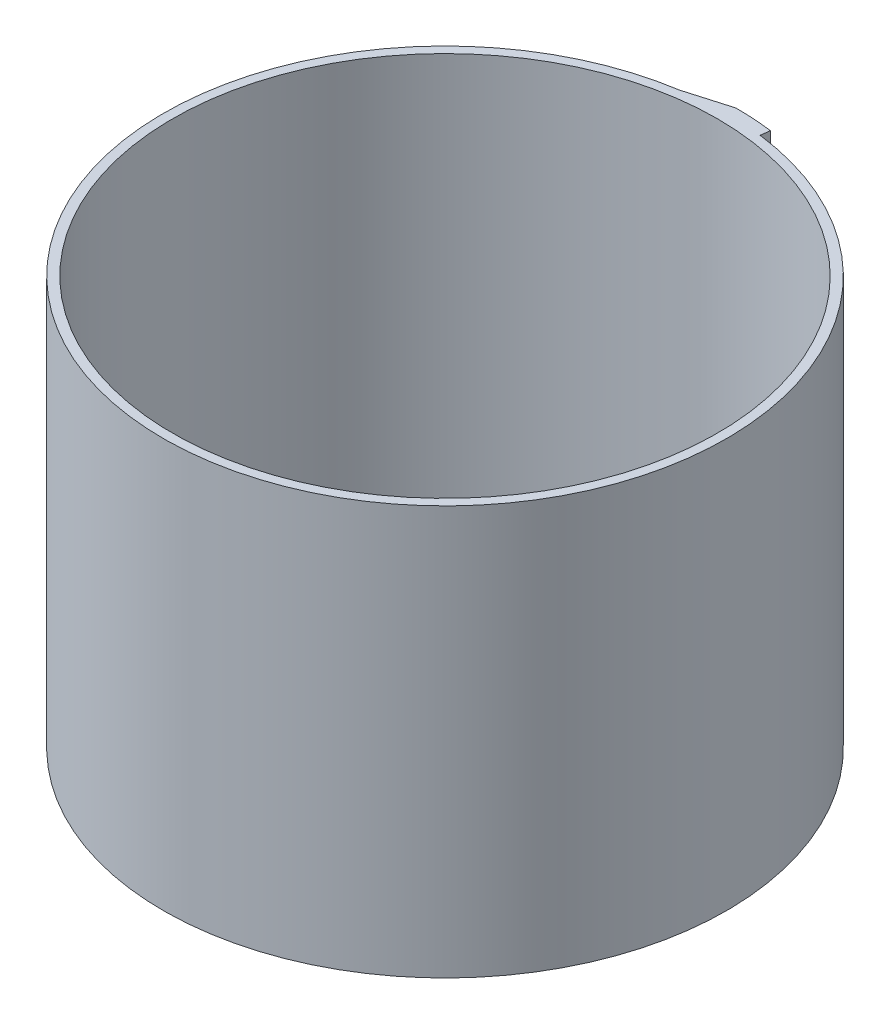
ISO-10303-21;
HEADER;
FILE_DESCRIPTION(('STEP AP214'),'2;1');
FILE_NAME('part.step','',(''),(''),'','','');
FILE_SCHEMA(('AUTOMOTIVE_DESIGN { 1 0 10303 214 1 1 1 1 }'));
ENDSEC;
DATA;
#1=APPLICATION_CONTEXT('core data for automotive mechanical design processes');
#2=APPLICATION_PROTOCOL_DEFINITION('international standard','automotive_design',2000,#1);
#3=PRODUCT_CONTEXT('',#1,'mechanical');
#4=PRODUCT('Part','Part','',(#3));
#5=PRODUCT_RELATED_PRODUCT_CATEGORY('part','',(#4));
#6=PRODUCT_DEFINITION_FORMATION('','',#4);
#7=PRODUCT_DEFINITION_CONTEXT('part definition',#1,'design');
#8=PRODUCT_DEFINITION('design','',#6,#7);
#9=PRODUCT_DEFINITION_SHAPE('','',#8);
#10=(LENGTH_UNIT() NAMED_UNIT(*) SI_UNIT(.MILLI.,.METRE.));
#11=(NAMED_UNIT(*) PLANE_ANGLE_UNIT() SI_UNIT($,.RADIAN.));
#12=(NAMED_UNIT(*) SI_UNIT($,.STERADIAN.) SOLID_ANGLE_UNIT());
#13=UNCERTAINTY_MEASURE_WITH_UNIT(LENGTH_MEASURE(1.E-05),#10,'distance_accuracy_value','');
#14=(GEOMETRIC_REPRESENTATION_CONTEXT(3) GLOBAL_UNCERTAINTY_ASSIGNED_CONTEXT((#13)) GLOBAL_UNIT_ASSIGNED_CONTEXT((#10,
#11,#12)) REPRESENTATION_CONTEXT('',''));
#15=CARTESIAN_POINT('',(0.,0.,0.));
#16=DIRECTION('',(0.,0.,1.));
#17=DIRECTION('',(1.,0.,0.));
#18=AXIS2_PLACEMENT_3D('',#15,#16,#17);
#19=CARTESIAN_POINT('',(-8.57396600948997,45.,-29.5306215414866));
#20=DIRECTION('',(0.27882698313554,0.,0.960341352580182));
#21=DIRECTION('',(0.960341352580182,0.,-0.278826983135541));
#22=AXIS2_PLACEMENT_3D('',#19,#20,#21);
#23=PLANE('',#22);
#24=DIRECTION('',(-0.960341352580182,0.,0.27882698313554));
#25=VECTOR('',#24,1.);
#26=CARTESIAN_POINT('',(-8.57396600948997,0.,-29.5306215414866));
#27=LINE('',#26,#25);
#28=CARTESIAN_POINT('',(0.,0.,-32.02));
#29=VERTEX_POINT('',#28);
#30=CARTESIAN_POINT('',(-4.80170676290091,0.,-30.6258650843223));
#31=VERTEX_POINT('',#30);
#32=EDGE_CURVE('E106',#29,#31,#27,.T.);
#33=ORIENTED_EDGE('',*,*,#32,.T.);
#34=DIRECTION('',(0.,-1.,0.));
#35=VECTOR('',#34,1.);
#36=CARTESIAN_POINT('',(-4.80170676290091,45.,-30.6258650843223));
#37=LINE('',#36,#35);
#38=CARTESIAN_POINT('',(-4.80170676290091,45.,-30.6258650843223));
#39=VERTEX_POINT('',#38);
#40=EDGE_CURVE('E11',#39,#31,#37,.T.);
#41=ORIENTED_EDGE('',*,*,#40,.F.);
#42=DIRECTION('',(-0.960341352580182,0.,0.27882698313554));
#43=VECTOR('',#42,1.);
#44=CARTESIAN_POINT('',(-8.57396600948997,45.,-29.5306215414866));
#45=LINE('',#44,#43);
#46=CARTESIAN_POINT('',(0.,45.,-32.02));
#47=VERTEX_POINT('',#46);
#48=EDGE_CURVE('E89',#47,#39,#45,.T.);
#49=ORIENTED_EDGE('',*,*,#48,.F.);
#50=DIRECTION('',(0.,-1.,0.));
#51=VECTOR('',#50,1.);
#52=CARTESIAN_POINT('',(0.,45.,-32.02));
#53=LINE('',#52,#51);
#54=EDGE_CURVE('E55',#47,#29,#53,.T.);
#55=ORIENTED_EDGE('',*,*,#54,.T.);
#56=EDGE_LOOP('',(#33,#41,#49,#55));
#57=FACE_BOUND('',#56,.T.);
#58=ADVANCED_FACE('F39',(#57),#23,.F.);
#59=CARTESIAN_POINT('',(0.,45.,0.));
#60=DIRECTION('',(0.,-1.,0.));
#61=DIRECTION('',(0.,0.,-1.));
#62=AXIS2_PLACEMENT_3D('',#59,#60,#61);
#63=CYLINDRICAL_SURFACE('',#62,31.);
#64=CARTESIAN_POINT('',(0.,0.,0.));
#65=DIRECTION('',(0.,1.,0.));
#66=DIRECTION('',(0.,0.,1.));
#67=AXIS2_PLACEMENT_3D('',#64,#65,#66);
#68=CIRCLE('',#67,31.);
#69=CARTESIAN_POINT('',(3.9352586480482,0.,-30.7492071340541));
#70=VERTEX_POINT('',#69);
#71=EDGE_CURVE('E94',#31,#70,#68,.T.);
#72=ORIENTED_EDGE('',*,*,#71,.T.);
#73=DIRECTION('',(0.,-1.,0.));
#74=VECTOR('',#73,1.);
#75=CARTESIAN_POINT('',(3.9352586480482,45.,-30.7492071340541));
#76=LINE('',#75,#74);
#77=CARTESIAN_POINT('',(3.9352586480482,45.,-30.7492071340541));
#78=VERTEX_POINT('',#77);
#79=EDGE_CURVE('E47',#78,#70,#76,.T.);
#80=ORIENTED_EDGE('',*,*,#79,.F.);
#81=CARTESIAN_POINT('',(0.,45.,0.));
#82=DIRECTION('',(0.,1.,0.));
#83=DIRECTION('',(0.,0.,1.));
#84=AXIS2_PLACEMENT_3D('',#81,#82,#83);
#85=CIRCLE('',#84,31.);
#86=EDGE_CURVE('E80',#39,#78,#85,.T.);
#87=ORIENTED_EDGE('',*,*,#86,.F.);
#88=ORIENTED_EDGE('',*,*,#40,.T.);
#89=EDGE_LOOP('',(#72,#80,#87,#88));
#90=FACE_BOUND('',#89,.T.);
#91=ADVANCED_FACE('F93',(#90),#63,.T.);
#92=CARTESIAN_POINT('',(0.,45.,0.));
#93=DIRECTION('',(0.991909907550131,0.,0.126943827356394));
#94=DIRECTION('',(0.126943827356394,0.,-0.991909907550131));
#95=AXIS2_PLACEMENT_3D('',#92,#93,#94);
#96=PLANE('',#95);
#97=DIRECTION('',(-0.126943827356394,0.,0.991909907550131));
#98=VECTOR('',#97,1.);
#99=CARTESIAN_POINT('',(0.,0.,0.));
#100=LINE('',#99,#98);
#101=CARTESIAN_POINT('',(4.06474135195172,0.,-31.7609552397552));
#102=VERTEX_POINT('',#101);
#103=EDGE_CURVE('E109',#102,#70,#100,.T.);
#104=ORIENTED_EDGE('',*,*,#103,.F.);
#105=DIRECTION('',(0.,-1.,0.));
#106=VECTOR('',#105,1.);
#107=CARTESIAN_POINT('',(4.06474135195172,45.,-31.7609552397552));
#108=LINE('',#107,#106);
#109=CARTESIAN_POINT('',(4.06474135195172,45.,-31.7609552397552));
#110=VERTEX_POINT('',#109);
#111=EDGE_CURVE('E69',#110,#102,#108,.T.);
#112=ORIENTED_EDGE('',*,*,#111,.F.);
#113=DIRECTION('',(-0.126943827356394,0.,0.991909907550131));
#114=VECTOR('',#113,1.);
#115=CARTESIAN_POINT('',(0.,45.,0.));
#116=LINE('',#115,#114);
#117=EDGE_CURVE('E88',#110,#78,#116,.T.);
#118=ORIENTED_EDGE('',*,*,#117,.T.);
#119=ORIENTED_EDGE('',*,*,#79,.T.);
#120=EDGE_LOOP('',(#104,#112,#118,#119));
#121=FACE_BOUND('',#120,.T.);
#122=ADVANCED_FACE('F97',(#121),#96,.T.);
#123=CARTESIAN_POINT('',(0.,45.,2.70616862252382E-13));
#124=DIRECTION('',(0.,-1.,0.));
#125=DIRECTION('',(0.,0.,-1.));
#126=AXIS2_PLACEMENT_3D('',#123,#124,#125);
#127=CYLINDRICAL_SURFACE('',#126,32.0200000000003);
#128=CARTESIAN_POINT('',(0.,0.,2.70616862252382E-13));
#129=DIRECTION('',(0.,1.,0.));
#130=DIRECTION('',(0.,0.,1.));
#131=AXIS2_PLACEMENT_3D('',#128,#129,#130);
#132=CIRCLE('',#131,32.0200000000003);
#133=EDGE_CURVE('E111',#29,#102,#132,.F.);
#134=ORIENTED_EDGE('',*,*,#133,.F.);
#135=ORIENTED_EDGE('',*,*,#54,.F.);
#136=CARTESIAN_POINT('',(0.,45.,2.70616862252382E-13));
#137=DIRECTION('',(0.,1.,0.));
#138=DIRECTION('',(0.,0.,1.));
#139=AXIS2_PLACEMENT_3D('',#136,#137,#138);
#140=CIRCLE('',#139,32.0200000000003);
#141=EDGE_CURVE('E98',#47,#110,#140,.F.);
#142=ORIENTED_EDGE('',*,*,#141,.T.);
#143=ORIENTED_EDGE('',*,*,#111,.T.);
#144=EDGE_LOOP('',(#134,#135,#142,#143));
#145=FACE_BOUND('',#144,.T.);
#146=ADVANCED_FACE('F124',(#145),#127,.T.);
#147=CARTESIAN_POINT('',(0.,45.,0.));
#148=DIRECTION('',(0.,-1.,0.));
#149=DIRECTION('',(0.,0.,-1.));
#150=AXIS2_PLACEMENT_3D('',#147,#148,#149);
#151=CYLINDRICAL_SURFACE('',#150,29.98);
#152=CARTESIAN_POINT('',(0.,45.,0.));
#153=DIRECTION('',(0.,1.,0.));
#154=DIRECTION('',(0.,0.,1.));
#155=AXIS2_PLACEMENT_3D('',#152,#153,#154);
#156=CIRCLE('',#155,29.98);
#157=CARTESIAN_POINT('',(0.,45.,-29.98));
#158=VERTEX_POINT('',#157);
#159=EDGE_CURVE('E100',#158,#158,#156,.T.);
#160=CARTESIAN_POINT('',(0.,0.,0.));
#161=DIRECTION('',(0.,1.,0.));
#162=DIRECTION('',(0.,0.,1.));
#163=AXIS2_PLACEMENT_3D('',#160,#161,#162);
#164=CIRCLE('',#163,29.98);
#165=CARTESIAN_POINT('',(0.,0.,-29.98));
#166=VERTEX_POINT('',#165);
#167=EDGE_CURVE('E114',#166,#166,#164,.T.);
#168=CARTESIAN_POINT('',(0.,45.,-29.98));
#169=CARTESIAN_POINT('',(0.,44.53125,-29.98));
#170=CARTESIAN_POINT('',(0.,44.0625,-29.98));
#171=CARTESIAN_POINT('',(0.,43.125,-29.98));
#172=CARTESIAN_POINT('',(0.,42.65625,-29.98));
#173=CARTESIAN_POINT('',(0.,41.71875,-29.98));
#174=CARTESIAN_POINT('',(0.,41.25,-29.98));
#175=CARTESIAN_POINT('',(0.,40.3125,-29.98));
#176=CARTESIAN_POINT('',(0.,39.84375,-29.98));
#177=CARTESIAN_POINT('',(0.,38.90625,-29.98));
#178=CARTESIAN_POINT('',(0.,38.4375,-29.98));
#179=CARTESIAN_POINT('',(0.,37.5,-29.98));
#180=CARTESIAN_POINT('',(0.,37.03125,-29.98));
#181=CARTESIAN_POINT('',(0.,36.09375,-29.98));
#182=CARTESIAN_POINT('',(0.,35.625,-29.98));
#183=CARTESIAN_POINT('',(0.,34.6875,-29.98));
#184=CARTESIAN_POINT('',(0.,34.21875,-29.98));
#185=CARTESIAN_POINT('',(0.,33.28125,-29.98));
#186=CARTESIAN_POINT('',(0.,32.8125,-29.98));
#187=CARTESIAN_POINT('',(0.,31.875,-29.98));
#188=CARTESIAN_POINT('',(0.,31.40625,-29.98));
#189=CARTESIAN_POINT('',(0.,30.46875,-29.98));
#190=CARTESIAN_POINT('',(0.,30.,-29.98));
#191=CARTESIAN_POINT('',(0.,29.0625,-29.98));
#192=CARTESIAN_POINT('',(0.,28.59375,-29.98));
#193=CARTESIAN_POINT('',(0.,27.65625,-29.98));
#194=CARTESIAN_POINT('',(0.,27.1875,-29.98));
#195=CARTESIAN_POINT('',(0.,26.25,-29.98));
#196=CARTESIAN_POINT('',(0.,25.78125,-29.98));
#197=CARTESIAN_POINT('',(0.,24.84375,-29.98));
#198=CARTESIAN_POINT('',(0.,24.375,-29.98));
#199=CARTESIAN_POINT('',(0.,23.4375,-29.98));
#200=CARTESIAN_POINT('',(0.,22.96875,-29.98));
#201=CARTESIAN_POINT('',(0.,22.03125,-29.98));
#202=CARTESIAN_POINT('',(0.,21.5625,-29.98));
#203=CARTESIAN_POINT('',(0.,20.625,-29.98));
#204=CARTESIAN_POINT('',(0.,20.15625,-29.98));
#205=CARTESIAN_POINT('',(0.,19.21875,-29.98));
#206=CARTESIAN_POINT('',(0.,18.75,-29.98));
#207=CARTESIAN_POINT('',(0.,17.8125,-29.98));
#208=CARTESIAN_POINT('',(0.,17.34375,-29.98));
#209=CARTESIAN_POINT('',(0.,16.40625,-29.98));
#210=CARTESIAN_POINT('',(0.,15.9375,-29.98));
#211=CARTESIAN_POINT('',(0.,15.,-29.98));
#212=CARTESIAN_POINT('',(0.,14.53125,-29.98));
#213=CARTESIAN_POINT('',(0.,13.59375,-29.98));
#214=CARTESIAN_POINT('',(0.,13.125,-29.98));
#215=CARTESIAN_POINT('',(0.,12.1875,-29.98));
#216=CARTESIAN_POINT('',(0.,11.71875,-29.98));
#217=CARTESIAN_POINT('',(0.,10.78125,-29.98));
#218=CARTESIAN_POINT('',(0.,10.3125,-29.98));
#219=CARTESIAN_POINT('',(0.,9.375,-29.98));
#220=CARTESIAN_POINT('',(0.,8.90625,-29.98));
#221=CARTESIAN_POINT('',(0.,7.96874999999999,-29.98));
#222=CARTESIAN_POINT('',(0.,7.5,-29.98));
#223=CARTESIAN_POINT('',(0.,6.5625,-29.98));
#224=CARTESIAN_POINT('',(0.,6.09375,-29.98));
#225=CARTESIAN_POINT('',(0.,5.15625,-29.98));
#226=CARTESIAN_POINT('',(0.,4.68749999999999,-29.98));
#227=CARTESIAN_POINT('',(0.,3.74999999999999,-29.98));
#228=CARTESIAN_POINT('',(0.,3.28124999999999,-29.98));
#229=CARTESIAN_POINT('',(0.,2.34374999999999,-29.98));
#230=CARTESIAN_POINT('',(0.,1.87499999999999,-29.98));
#231=CARTESIAN_POINT('',(0.,0.937499999999992,-29.98));
#232=CARTESIAN_POINT('',(0.,0.468749999999993,-29.98));
#233=CARTESIAN_POINT('',(0.,0.,-29.98));
#234=B_SPLINE_CURVE_WITH_KNOTS('',3,(#168,#169,#170,#171,#172,#173,#174,#175,#176,#177,#178,
#179,#180,#181,#182,#183,#184,#185,#186,#187,#188,#189,#190,#191,#192,#193,#194,#195,#196,#197,
#198,#199,#200,#201,#202,#203,#204,#205,#206,#207,#208,#209,#210,#211,#212,#213,#214,#215,#216,
#217,#218,#219,#220,#221,#222,#223,#224,#225,#226,#227,#228,#229,#230,#231,#232,#233),
.UNSPECIFIED.,.F.,.F.,(4,2,2,2,2,2,2,2,2,2,2,2,2,2,2,2,2,2,2,2,2,2,2,2,2,2,2,2,2,2,2,2,4),(0.,
1.40625,2.8125,4.21875000000001,5.62500000000001,7.03125,8.4375,9.84375000000001,11.25,12.65625,
14.0625,15.46875,16.875,18.28125,19.6875,21.09375,22.5,23.90625,25.3125,26.71875,28.125,
29.53125,30.9375,32.34375,33.75,35.15625,36.5625,37.96875,39.375,40.78125,42.1875,43.59375,45.),.UNSPECIFIED.);
#235=EDGE_CURVE('BSEAM122',#158,#166,#234,.T.);
#236=ORIENTED_EDGE('',*,*,#159,.T.);
#237=ORIENTED_EDGE('',*,*,#167,.F.);
#238=ORIENTED_EDGE('',*,*,#235,.T.);
#239=ORIENTED_EDGE('',*,*,#235,.F.);
#240=EDGE_LOOP('',(#236,#238,#237,#239));
#241=FACE_BOUND('',#240,.T.);
#242=ADVANCED_FACE('F122',(#241),#151,.F.);
#243=CARTESIAN_POINT('',(0.,45.,0.));
#244=DIRECTION('',(0.,1.,0.));
#245=DIRECTION('',(0.,0.,1.));
#246=AXIS2_PLACEMENT_3D('',#243,#244,#245);
#247=PLANE('',#246);
#248=ORIENTED_EDGE('',*,*,#48,.T.);
#249=ORIENTED_EDGE('',*,*,#86,.T.);
#250=ORIENTED_EDGE('',*,*,#117,.F.);
#251=ORIENTED_EDGE('',*,*,#141,.F.);
#252=EDGE_LOOP('',(#248,#249,#250,#251));
#253=FACE_BOUND('',#252,.T.);
#254=ORIENTED_EDGE('',*,*,#159,.F.);
#255=EDGE_LOOP('',(#254));
#256=FACE_BOUND('',#255,.T.);
#257=ADVANCED_FACE('F84',(#253,#256),#247,.T.);
#258=CARTESIAN_POINT('',(0.,0.,0.));
#259=DIRECTION('',(0.,1.,0.));
#260=DIRECTION('',(0.,0.,1.));
#261=AXIS2_PLACEMENT_3D('',#258,#259,#260);
#262=PLANE('',#261);
#263=ORIENTED_EDGE('',*,*,#32,.F.);
#264=ORIENTED_EDGE('',*,*,#133,.T.);
#265=ORIENTED_EDGE('',*,*,#103,.T.);
#266=ORIENTED_EDGE('',*,*,#71,.F.);
#267=EDGE_LOOP('',(#263,#264,#265,#266));
#268=FACE_BOUND('',#267,.T.);
#269=ORIENTED_EDGE('',*,*,#167,.T.);
#270=EDGE_LOOP('',(#269));
#271=FACE_BOUND('',#270,.T.);
#272=ADVANCED_FACE('F120',(#268,#271),#262,.F.);
#273=CLOSED_SHELL('',(#58,#91,#122,#146,#242,#257,#272));
#274=MANIFOLD_SOLID_BREP('B2',#273);
#275=ADVANCED_BREP_SHAPE_REPRESENTATION('',(#18,#274),#14);
#276=SHAPE_DEFINITION_REPRESENTATION(#9,#275);
ENDSEC;
END-ISO-10303-21;
